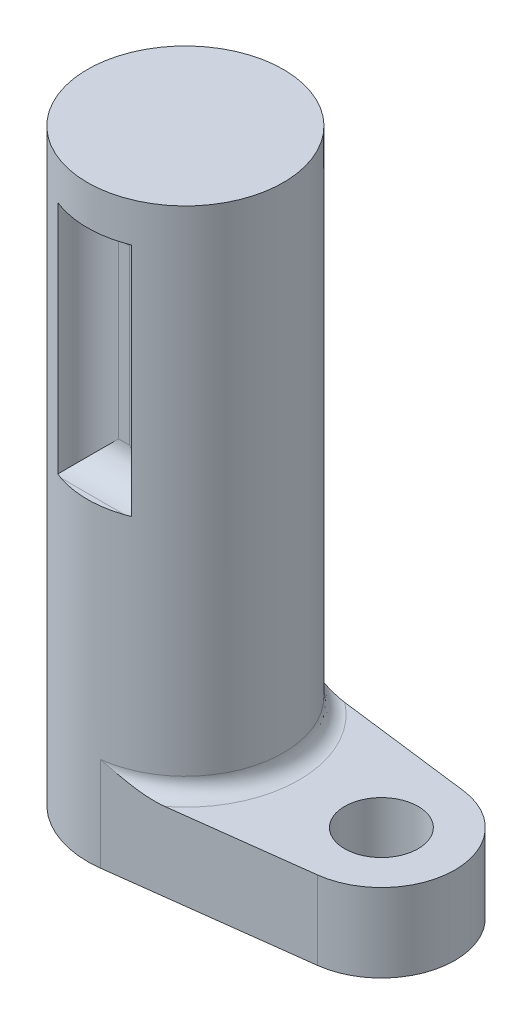
ISO-10303-21;
HEADER;
FILE_DESCRIPTION(('STEP AP214'),'2;1');
FILE_NAME('part.step','',(''),(''),'','','');
FILE_SCHEMA(('AUTOMOTIVE_DESIGN { 1 0 10303 214 1 1 1 1 }'));
ENDSEC;
DATA;
#1=APPLICATION_CONTEXT('core data for automotive mechanical design processes');
#2=APPLICATION_PROTOCOL_DEFINITION('international standard','automotive_design',2000,#1);
#3=PRODUCT_CONTEXT('',#1,'mechanical');
#4=PRODUCT('Part','Part','',(#3));
#5=PRODUCT_RELATED_PRODUCT_CATEGORY('part','',(#4));
#6=PRODUCT_DEFINITION_FORMATION('','',#4);
#7=PRODUCT_DEFINITION_CONTEXT('part definition',#1,'design');
#8=PRODUCT_DEFINITION('design','',#6,#7);
#9=PRODUCT_DEFINITION_SHAPE('','',#8);
#10=(LENGTH_UNIT() NAMED_UNIT(*) SI_UNIT(.MILLI.,.METRE.));
#11=(NAMED_UNIT(*) PLANE_ANGLE_UNIT() SI_UNIT($,.RADIAN.));
#12=(NAMED_UNIT(*) SI_UNIT($,.STERADIAN.) SOLID_ANGLE_UNIT());
#13=UNCERTAINTY_MEASURE_WITH_UNIT(LENGTH_MEASURE(1.E-05),#10,'distance_accuracy_value','');
#14=(GEOMETRIC_REPRESENTATION_CONTEXT(3) GLOBAL_UNCERTAINTY_ASSIGNED_CONTEXT((#13)) GLOBAL_UNIT_ASSIGNED_CONTEXT((#10,
#11,#12)) REPRESENTATION_CONTEXT('',''));
#15=CARTESIAN_POINT('',(0.,0.,0.));
#16=DIRECTION('',(0.,0.,1.));
#17=DIRECTION('',(1.,0.,0.));
#18=AXIS2_PLACEMENT_3D('',#15,#16,#17);
#19=CARTESIAN_POINT('',(0.,16.51,0.));
#20=DIRECTION('',(0.,-1.,0.));
#21=DIRECTION('',(0.,0.,-1.));
#22=AXIS2_PLACEMENT_3D('',#19,#20,#21);
#23=CYLINDRICAL_SURFACE('',#22,3.175);
#24=CARTESIAN_POINT('',(0.,0.508000000000002,0.));
#25=DIRECTION('',(0.,-1.,0.));
#26=DIRECTION('',(0.,0.,-1.));
#27=AXIS2_PLACEMENT_3D('',#24,#25,#26);
#28=CIRCLE('',#27,3.175);
#29=CARTESIAN_POINT('',(0.396875,0.508000000000002,3.15009765473628));
#30=VERTEX_POINT('',#29);
#31=CARTESIAN_POINT('',(0.396875,0.508000000000002,-3.15009765473628));
#32=VERTEX_POINT('',#31);
#33=EDGE_CURVE('E168',#30,#32,#28,.F.);
#34=ORIENTED_EDGE('',*,*,#33,.T.);
#35=DIRECTION('',(0.,1.,0.));
#36=VECTOR('',#35,1.);
#37=CARTESIAN_POINT('',(0.396875,-2.54,-3.15009765473628));
#38=LINE('',#37,#36);
#39=CARTESIAN_POINT('',(0.396875,-2.54,-3.15009765473628));
#40=VERTEX_POINT('',#39);
#41=EDGE_CURVE('E153',#40,#32,#38,.T.);
#42=ORIENTED_EDGE('',*,*,#41,.F.);
#43=CARTESIAN_POINT('',(0.,-2.54,0.));
#44=DIRECTION('',(0.,-1.,0.));
#45=DIRECTION('',(0.,0.,-1.));
#46=AXIS2_PLACEMENT_3D('',#43,#44,#45);
#47=CIRCLE('',#46,3.175);
#48=CARTESIAN_POINT('',(0.396875,-2.54,3.15009765473628));
#49=VERTEX_POINT('',#48);
#50=EDGE_CURVE('E141',#49,#40,#47,.T.);
#51=ORIENTED_EDGE('',*,*,#50,.F.);
#52=DIRECTION('',(0.,1.,0.));
#53=VECTOR('',#52,1.);
#54=CARTESIAN_POINT('',(0.396875,-2.54,3.15009765473628));
#55=LINE('',#54,#53);
#56=EDGE_CURVE('E163',#49,#30,#55,.T.);
#57=ORIENTED_EDGE('',*,*,#56,.T.);
#58=EDGE_LOOP('',(#34,#42,#51,#57));
#59=FACE_BOUND('',#58,.T.);
#60=CARTESIAN_POINT('',(0.,16.51,0.));
#61=DIRECTION('',(0.,1.,0.));
#62=DIRECTION('',(0.,0.,1.));
#63=AXIS2_PLACEMENT_3D('',#60,#61,#62);
#64=CIRCLE('',#63,3.175);
#65=CARTESIAN_POINT('',(0.,16.51,3.175));
#66=VERTEX_POINT('',#65);
#67=EDGE_CURVE('E131',#66,#66,#64,.T.);
#68=ORIENTED_EDGE('',*,*,#67,.F.);
#69=EDGE_LOOP('',(#68));
#70=FACE_BOUND('',#69,.T.);
#71=CARTESIAN_POINT('',(0.,15.24,0.));
#72=DIRECTION('',(0.,-1.,0.));
#73=DIRECTION('',(0.,0.,-1.));
#74=AXIS2_PLACEMENT_3D('',#71,#72,#73);
#75=CIRCLE('',#74,3.175);
#76=CARTESIAN_POINT('',(1.03292778140585,15.24,3.00228));
#77=VERTEX_POINT('',#76);
#78=CARTESIAN_POINT('',(-1.03292778140585,15.24,3.00228));
#79=VERTEX_POINT('',#78);
#80=EDGE_CURVE('E250',#77,#79,#75,.T.);
#81=ORIENTED_EDGE('',*,*,#80,.F.);
#82=CARTESIAN_POINT('',(1.03292778140585,15.24,3.00228));
#83=CARTESIAN_POINT('',(1.05947422604966,15.2400200288164,2.99314652903374));
#84=CARTESIAN_POINT('',(1.08588888328537,15.2398872803439,2.98366510808526));
#85=CARTESIAN_POINT('',(1.1384546228155,15.2393162288226,2.96400636627064));
#86=CARTESIAN_POINT('',(1.16460570511117,15.2388779257752,2.95382904540782));
#87=CARTESIAN_POINT('',(1.190625,15.2382868454405,2.94330377456609));
#88=B_SPLINE_CURVE_WITH_KNOTS('',3,(#82,#83,#84,#85,#86,#87),.UNSPECIFIED.,.F.,.F.,(4,2,4),(0.,
0.0841952596062047,0.168390518811633),.UNSPECIFIED.);
#89=CARTESIAN_POINT('',(1.190625,15.2382868454405,2.94330377456609));
#90=VERTEX_POINT('',#89);
#91=EDGE_CURVE('E11',#77,#90,#88,.T.);
#92=ORIENTED_EDGE('',*,*,#91,.T.);
#93=DIRECTION('',(0.,-1.,0.));
#94=VECTOR('',#93,1.);
#95=CARTESIAN_POINT('',(1.190625,16.51,2.94330377456609));
#96=LINE('',#95,#94);
#97=CARTESIAN_POINT('',(1.190625,7.62171315455953,2.94330377456609));
#98=VERTEX_POINT('',#97);
#99=EDGE_CURVE('E249',#98,#90,#96,.F.);
#100=ORIENTED_EDGE('',*,*,#99,.F.);
#101=CARTESIAN_POINT('',(1.190625,7.62171315455953,2.94330377456609));
#102=CARTESIAN_POINT('',(1.16460570511117,7.62112207422477,2.95382904540782));
#103=CARTESIAN_POINT('',(1.1384546228155,7.62068377117741,2.96400636627064));
#104=CARTESIAN_POINT('',(1.08588888328537,7.62011271965611,2.98366510808526));
#105=CARTESIAN_POINT('',(1.05947422604966,7.61997997118363,2.99314652903374));
#106=CARTESIAN_POINT('',(1.03292778140585,7.62,3.00228));
#107=B_SPLINE_CURVE_WITH_KNOTS('',3,(#101,#102,#103,#104,#105,#106),.UNSPECIFIED.,.F.,.F.,(4,2,
4),(0.,0.0841952592054279,0.168390518811633),.UNSPECIFIED.);
#108=CARTESIAN_POINT('',(1.03292778140585,7.62,3.00228));
#109=VERTEX_POINT('',#108);
#110=EDGE_CURVE('E218',#98,#109,#107,.T.);
#111=ORIENTED_EDGE('',*,*,#110,.T.);
#112=CARTESIAN_POINT('',(0.,7.62,0.));
#113=DIRECTION('',(0.,-1.,0.));
#114=DIRECTION('',(0.,0.,-1.));
#115=AXIS2_PLACEMENT_3D('',#112,#113,#114);
#116=CIRCLE('',#115,3.175);
#117=CARTESIAN_POINT('',(-1.03292778140585,7.62,3.00228));
#118=VERTEX_POINT('',#117);
#119=EDGE_CURVE('E255',#109,#118,#116,.T.);
#120=ORIENTED_EDGE('',*,*,#119,.T.);
#121=CARTESIAN_POINT('',(-1.03292778140585,7.62,3.00228));
#122=CARTESIAN_POINT('',(-1.05947422604966,7.61997997118363,2.99314652903374));
#123=CARTESIAN_POINT('',(-1.08588888328537,7.62011271965611,2.98366510808526));
#124=CARTESIAN_POINT('',(-1.1384546228155,7.62068377117741,2.96400636627064));
#125=CARTESIAN_POINT('',(-1.16460570511117,7.62112207422477,2.95382904540782));
#126=CARTESIAN_POINT('',(-1.190625,7.62171315455953,2.94330377456609));
#127=B_SPLINE_CURVE_WITH_KNOTS('',3,(#121,#122,#123,#124,#125,#126),.UNSPECIFIED.,.F.,.F.,(4,2,
4),(0.,0.0841952596062047,0.168390518811633),.UNSPECIFIED.);
#128=CARTESIAN_POINT('',(-1.190625,7.62171315455953,2.94330377456609));
#129=VERTEX_POINT('',#128);
#130=EDGE_CURVE('E212',#118,#129,#127,.T.);
#131=ORIENTED_EDGE('',*,*,#130,.T.);
#132=DIRECTION('',(0.,-1.,0.));
#133=VECTOR('',#132,1.);
#134=CARTESIAN_POINT('',(-1.190625,16.51,2.94330377456609));
#135=LINE('',#134,#133);
#136=CARTESIAN_POINT('',(-1.190625,15.2382868454405,2.94330377456609));
#137=VERTEX_POINT('',#136);
#138=EDGE_CURVE('E251',#137,#129,#135,.T.);
#139=ORIENTED_EDGE('',*,*,#138,.F.);
#140=CARTESIAN_POINT('',(-1.190625,15.2382868454405,2.94330377456609));
#141=CARTESIAN_POINT('',(-1.16460570511117,15.2388779257752,2.95382904540782));
#142=CARTESIAN_POINT('',(-1.1384546228155,15.2393162288226,2.96400636627064));
#143=CARTESIAN_POINT('',(-1.08588888328537,15.2398872803439,2.98366510808526));
#144=CARTESIAN_POINT('',(-1.05947422604966,15.2400200288164,2.99314652903374));
#145=CARTESIAN_POINT('',(-1.03292778140585,15.24,3.00228));
#146=B_SPLINE_CURVE_WITH_KNOTS('',3,(#140,#141,#142,#143,#144,#145),.UNSPECIFIED.,.F.,.F.,(4,2,
4),(0.,0.0841952592054285,0.168390518811633),.UNSPECIFIED.);
#147=EDGE_CURVE('E46',#137,#79,#146,.T.);
#148=ORIENTED_EDGE('',*,*,#147,.T.);
#149=EDGE_LOOP('',(#81,#92,#100,#111,#120,#131,#139,#148));
#150=FACE_BOUND('',#149,.T.);
#151=ADVANCED_FACE('F37',(#59,#70,#150),#23,.T.);
#152=CARTESIAN_POINT('',(0.,16.51,0.));
#153=DIRECTION('',(0.,1.,0.));
#154=DIRECTION('',(0.,0.,1.));
#155=AXIS2_PLACEMENT_3D('',#152,#153,#154);
#156=PLANE('',#155);
#157=ORIENTED_EDGE('',*,*,#67,.T.);
#158=EDGE_LOOP('',(#157));
#159=FACE_BOUND('',#158,.T.);
#160=ADVANCED_FACE('F285',(#159),#156,.T.);
#161=CARTESIAN_POINT('',(0.396875,-2.54,-3.15009765473628));
#162=DIRECTION('',(0.125,0.,-0.992156741649221));
#163=DIRECTION('',(-0.992156741649222,0.,-0.125));
#164=AXIS2_PLACEMENT_3D('',#161,#162,#163);
#165=PLANE('',#164);
#166=DIRECTION('',(-0.992156741649222,0.,-0.125));
#167=VECTOR('',#166,1.);
#168=CARTESIAN_POINT('',(0.396875,0.,-3.15009765473628));
#169=LINE('',#168,#167);
#170=CARTESIAN_POINT('',(6.64765625,0.,-2.36257324105221));
#171=VERTEX_POINT('',#170);
#172=CARTESIAN_POINT('',(2.24874665457004,0.,-2.91678375673618));
#173=VERTEX_POINT('',#172);
#174=EDGE_CURVE('E126',#171,#173,#169,.T.);
#175=ORIENTED_EDGE('',*,*,#174,.F.);
#176=DIRECTION('',(0.,1.,0.));
#177=VECTOR('',#176,1.);
#178=CARTESIAN_POINT('',(6.64765625,-2.54,-2.36257324105221));
#179=LINE('',#178,#177);
#180=CARTESIAN_POINT('',(6.64765625,-2.54,-2.36257324105221));
#181=VERTEX_POINT('',#180);
#182=EDGE_CURVE('E121',#181,#171,#179,.T.);
#183=ORIENTED_EDGE('',*,*,#182,.F.);
#184=DIRECTION('',(-0.992156741649222,0.,-0.125));
#185=VECTOR('',#184,1.);
#186=CARTESIAN_POINT('',(0.396875,-2.54,-3.15009765473628));
#187=LINE('',#186,#185);
#188=EDGE_CURVE('E124',#181,#40,#187,.T.);
#189=ORIENTED_EDGE('',*,*,#188,.T.);
#190=ORIENTED_EDGE('',*,*,#41,.T.);
#191=CARTESIAN_POINT('',(2.24874665457004,0.,-2.91678375673618));
#192=CARTESIAN_POINT('',(2.21231549692085,5.71728721592752E-06,-2.92137365117018));
#193=CARTESIAN_POINT('',(2.1758992098971,0.00102172884681024,-2.92596167208147));
#194=CARTESIAN_POINT('',(2.1031796100752,0.00485117368516612,-2.93512348048952));
#195=CARTESIAN_POINT('',(2.0668762431913,0.00766354336836887,-2.93969727480043));
#196=CARTESIAN_POINT('',(1.95839957562028,0.0184425634130274,-2.95336405029785));
#197=CARTESIAN_POINT('',(1.88645399557375,0.0287536847308181,-2.9624283413804));
#198=CARTESIAN_POINT('',(1.74411958427555,0.0541431163065831,-2.98036079163286));
#199=CARTESIAN_POINT('',(1.67372251439236,0.0691765666242501,-2.9892299887728));
#200=CARTESIAN_POINT('',(1.53378182393322,0.103023101549795,-3.00686085854677));
#201=CARTESIAN_POINT('',(1.46423892542614,0.121839177901396,-3.01562244020869));
#202=CARTESIAN_POINT('',(1.22704733837716,0.191369163494823,-3.04550577127576));
#203=CARTESIAN_POINT('',(1.06148442447234,0.249183267367272,-3.06636473777706));
#204=CARTESIAN_POINT('',(0.73302229538363,0.372566088486213,-3.10774707628523));
#205=CARTESIAN_POINT('',(0.570129927965523,0.438151996715627,-3.12826958555471));
#206=CARTESIAN_POINT('',(0.403795894832264,0.505209760541777,-3.14922570394694));
#207=CARTESIAN_POINT('',(0.400335450392073,0.506604880917865,-3.14966167896667));
#208=CARTESIAN_POINT('',(0.396875,0.508000000000002,-3.15009765473628));
#209=B_SPLINE_CURVE_WITH_KNOTS('',3,(#191,#192,#193,#194,#195,#196,#197,#198,#199,#200,#201,
#202,#203,#204,#205,#206,#207,#208),.UNSPECIFIED.,.F.,.F.,(4,2,2,2,2,2,2,2,4),(0.,
0.110120572144947,0.22017600398342,0.439667149666635,0.657133261980571,0.874772053488899,
1.40399836213705,1.93441795718018,1.94568738488306),.UNSPECIFIED.);
#210=EDGE_CURVE('E173',#32,#173,#209,.F.);
#211=ORIENTED_EDGE('',*,*,#210,.T.);
#212=EDGE_LOOP('',(#175,#183,#189,#190,#211));
#213=FACE_BOUND('',#212,.T.);
#214=ADVANCED_FACE('F123',(#213),#165,.T.);
#215=CARTESIAN_POINT('',(6.35,-2.54,0.));
#216=DIRECTION('',(0.,1.,0.));
#217=DIRECTION('',(0.,0.,1.));
#218=AXIS2_PLACEMENT_3D('',#215,#216,#217);
#219=CYLINDRICAL_SURFACE('',#218,2.38125);
#220=CARTESIAN_POINT('',(6.35,0.,0.));
#221=DIRECTION('',(0.,-1.,0.));
#222=DIRECTION('',(0.,0.,-1.));
#223=AXIS2_PLACEMENT_3D('',#220,#221,#222);
#224=CIRCLE('',#223,2.38125);
#225=CARTESIAN_POINT('',(6.64765625,0.,2.36257324105221));
#226=VERTEX_POINT('',#225);
#227=EDGE_CURVE('E158',#226,#171,#224,.F.);
#228=ORIENTED_EDGE('',*,*,#227,.F.);
#229=DIRECTION('',(0.,1.,0.));
#230=VECTOR('',#229,1.);
#231=CARTESIAN_POINT('',(6.64765625,-2.54,2.36257324105221));
#232=LINE('',#231,#230);
#233=CARTESIAN_POINT('',(6.64765625,-2.54,2.36257324105221));
#234=VERTEX_POINT('',#233);
#235=EDGE_CURVE('E132',#234,#226,#232,.T.);
#236=ORIENTED_EDGE('',*,*,#235,.F.);
#237=CARTESIAN_POINT('',(6.35,-2.54,0.));
#238=DIRECTION('',(0.,-1.,0.));
#239=DIRECTION('',(0.,0.,-1.));
#240=AXIS2_PLACEMENT_3D('',#237,#238,#239);
#241=CIRCLE('',#240,2.38125);
#242=EDGE_CURVE('E138',#234,#181,#241,.F.);
#243=ORIENTED_EDGE('',*,*,#242,.T.);
#244=ORIENTED_EDGE('',*,*,#182,.T.);
#245=EDGE_LOOP('',(#228,#236,#243,#244));
#246=FACE_BOUND('',#245,.T.);
#247=ADVANCED_FACE('F145',(#246),#219,.T.);
#248=CARTESIAN_POINT('',(0.396875,-2.54,3.15009765473628));
#249=DIRECTION('',(0.125,0.,0.992156741649221));
#250=DIRECTION('',(0.992156741649222,0.,-0.125));
#251=AXIS2_PLACEMENT_3D('',#248,#249,#250);
#252=PLANE('',#251);
#253=DIRECTION('',(0.992156741649222,0.,-0.125));
#254=VECTOR('',#253,1.);
#255=CARTESIAN_POINT('',(0.396875,0.,3.15009765473628));
#256=LINE('',#255,#254);
#257=CARTESIAN_POINT('',(2.24874665457004,0.,2.91678375673618));
#258=VERTEX_POINT('',#257);
#259=EDGE_CURVE('E160',#258,#226,#256,.T.);
#260=ORIENTED_EDGE('',*,*,#259,.F.);
#261=CARTESIAN_POINT('',(2.24874665457004,0.,2.91678375673618));
#262=CARTESIAN_POINT('',(2.21231549692086,5.71728721580148E-06,2.92137365117018));
#263=CARTESIAN_POINT('',(2.17589920989712,0.00102172884680957,2.92596167208147));
#264=CARTESIAN_POINT('',(2.10317961007524,0.00485117368516336,2.93512348048951));
#265=CARTESIAN_POINT('',(2.06687624319136,0.00766354336836454,2.93969727480042));
#266=CARTESIAN_POINT('',(1.95839957562036,0.0184425634130171,2.95336405029784));
#267=CARTESIAN_POINT('',(1.88645399557386,0.028753684730802,2.96242834138038));
#268=CARTESIAN_POINT('',(1.74411958427564,0.0541431163065639,2.98036079163285));
#269=CARTESIAN_POINT('',(1.67372251439244,0.0691765666242362,2.98922998877279));
#270=CARTESIAN_POINT('',(1.53378182393325,0.103023101549782,3.00686085854677));
#271=CARTESIAN_POINT('',(1.46423892542615,0.121839177901378,3.01562244020869));
#272=CARTESIAN_POINT('',(1.22704733837717,0.191369163494857,3.04550577127576));
#273=CARTESIAN_POINT('',(1.0614844244724,0.249183267367469,3.06636473777705));
#274=CARTESIAN_POINT('',(0.733022295383541,0.372566088486026,3.10774707628524));
#275=CARTESIAN_POINT('',(0.570129927965227,0.438151996714891,3.12826958555474));
#276=CARTESIAN_POINT('',(0.403795894832254,0.505209760541744,3.14922570394694));
#277=CARTESIAN_POINT('',(0.400335450392068,0.506604880917849,3.14966167896667));
#278=CARTESIAN_POINT('',(0.396875,0.508000000000002,3.15009765473628));
#279=B_SPLINE_CURVE_WITH_KNOTS('',3,(#261,#262,#263,#264,#265,#266,#267,#268,#269,#270,#271,
#272,#273,#274,#275,#276,#277,#278),.UNSPECIFIED.,.F.,.F.,(4,2,2,2,2,2,2,2,4),(0.,
0.110120572144913,0.220176003983352,0.439667149666513,0.657133261980515,0.874772053488902,
1.40399836213707,1.93441795718017,1.94568738488306),.UNSPECIFIED.);
#280=EDGE_CURVE('E180',#258,#30,#279,.T.);
#281=ORIENTED_EDGE('',*,*,#280,.T.);
#282=ORIENTED_EDGE('',*,*,#56,.F.);
#283=DIRECTION('',(0.992156741649222,0.,-0.125));
#284=VECTOR('',#283,1.);
#285=CARTESIAN_POINT('',(0.396875,-2.54,3.15009765473628));
#286=LINE('',#285,#284);
#287=EDGE_CURVE('E147',#49,#234,#286,.T.);
#288=ORIENTED_EDGE('',*,*,#287,.T.);
#289=ORIENTED_EDGE('',*,*,#235,.T.);
#290=EDGE_LOOP('',(#260,#281,#282,#288,#289));
#291=FACE_BOUND('',#290,.T.);
#292=ADVANCED_FACE('F302',(#291),#252,.T.);
#293=CARTESIAN_POINT('',(6.35,-2.54,0.));
#294=DIRECTION('',(0.,1.,0.));
#295=DIRECTION('',(0.,0.,1.));
#296=AXIS2_PLACEMENT_3D('',#293,#294,#295);
#297=CYLINDRICAL_SURFACE('',#296,1.190625);
#298=CARTESIAN_POINT('',(6.35,-2.54,0.));
#299=DIRECTION('',(0.,-1.,0.));
#300=DIRECTION('',(0.,0.,-1.));
#301=AXIS2_PLACEMENT_3D('',#298,#299,#300);
#302=CIRCLE('',#301,1.190625);
#303=CARTESIAN_POINT('',(6.35,-2.54,-1.190625));
#304=VERTEX_POINT('',#303);
#305=EDGE_CURVE('E143',#304,#304,#302,.T.);
#306=ORIENTED_EDGE('',*,*,#305,.T.);
#307=EDGE_LOOP('',(#306));
#308=FACE_BOUND('',#307,.T.);
#309=CARTESIAN_POINT('',(6.35,0.,0.));
#310=DIRECTION('',(0.,-1.,0.));
#311=DIRECTION('',(0.,0.,-1.));
#312=AXIS2_PLACEMENT_3D('',#309,#310,#311);
#313=CIRCLE('',#312,1.190625);
#314=CARTESIAN_POINT('',(6.35,0.,-1.190625));
#315=VERTEX_POINT('',#314);
#316=EDGE_CURVE('E154',#315,#315,#313,.T.);
#317=ORIENTED_EDGE('',*,*,#316,.F.);
#318=EDGE_LOOP('',(#317));
#319=FACE_BOUND('',#318,.T.);
#320=ADVANCED_FACE('F304',(#308,#319),#297,.F.);
#321=CARTESIAN_POINT('',(0.,-2.54,0.));
#322=DIRECTION('',(0.,-1.,0.));
#323=DIRECTION('',(0.,0.,-1.));
#324=AXIS2_PLACEMENT_3D('',#321,#322,#323);
#325=PLANE('',#324);
#326=ORIENTED_EDGE('',*,*,#305,.F.);
#327=EDGE_LOOP('',(#326));
#328=FACE_BOUND('',#327,.T.);
#329=ORIENTED_EDGE('',*,*,#188,.F.);
#330=ORIENTED_EDGE('',*,*,#242,.F.);
#331=ORIENTED_EDGE('',*,*,#287,.F.);
#332=ORIENTED_EDGE('',*,*,#50,.T.);
#333=EDGE_LOOP('',(#329,#330,#331,#332));
#334=FACE_BOUND('',#333,.T.);
#335=ADVANCED_FACE('F136',(#328,#334),#325,.T.);
#336=CARTESIAN_POINT('',(0.,0.,0.));
#337=DIRECTION('',(0.,-1.,0.));
#338=DIRECTION('',(0.,0.,-1.));
#339=AXIS2_PLACEMENT_3D('',#336,#337,#338);
#340=PLANE('',#339);
#341=ORIENTED_EDGE('',*,*,#174,.T.);
#342=CARTESIAN_POINT('',(0.,0.,0.));
#343=DIRECTION('',(0.,-1.,0.));
#344=DIRECTION('',(0.,0.,-1.));
#345=AXIS2_PLACEMENT_3D('',#342,#343,#344);
#346=CIRCLE('',#345,3.683);
#347=EDGE_CURVE('E171',#173,#258,#346,.T.);
#348=ORIENTED_EDGE('',*,*,#347,.T.);
#349=ORIENTED_EDGE('',*,*,#259,.T.);
#350=ORIENTED_EDGE('',*,*,#227,.T.);
#351=EDGE_LOOP('',(#341,#348,#349,#350));
#352=FACE_BOUND('',#351,.T.);
#353=ORIENTED_EDGE('',*,*,#316,.T.);
#354=EDGE_LOOP('',(#353));
#355=FACE_BOUND('',#354,.T.);
#356=ADVANCED_FACE('F195',(#352,#355),#340,.F.);
#357=CARTESIAN_POINT('',(0.,0.508000000000002,0.));
#358=DIRECTION('',(0.,-1.,0.));
#359=DIRECTION('',(0.,0.,-1.));
#360=AXIS2_PLACEMENT_3D('',#357,#358,#359);
#361=TOROIDAL_SURFACE('',#360,3.683,0.508);
#362=ORIENTED_EDGE('',*,*,#280,.F.);
#363=ORIENTED_EDGE('',*,*,#347,.F.);
#364=ORIENTED_EDGE('',*,*,#210,.F.);
#365=ORIENTED_EDGE('',*,*,#33,.F.);
#366=EDGE_LOOP('',(#362,#363,#364,#365));
#367=FACE_BOUND('',#366,.T.);
#368=ADVANCED_FACE('F189',(#367),#361,.F.);
#369=CARTESIAN_POINT('',(0.,15.24,0.));
#370=DIRECTION('',(0.,-1.,0.));
#371=DIRECTION('',(0.,0.,-1.));
#372=AXIS2_PLACEMENT_3D('',#369,#370,#371);
#373=PLANE('',#372);
#374=ORIENTED_EDGE('',*,*,#80,.T.);
#375=DIRECTION('',(-1.,0.,0.));
#376=VECTOR('',#375,1.);
#377=CARTESIAN_POINT('',(1.190625,15.24,3.00228));
#378=LINE('',#377,#376);
#379=EDGE_CURVE('E59',#79,#77,#378,.F.);
#380=ORIENTED_EDGE('',*,*,#379,.T.);
#381=EDGE_LOOP('',(#374,#380));
#382=FACE_BOUND('',#381,.T.);
#383=ADVANCED_FACE('F194',(#382),#373,.T.);
#384=CARTESIAN_POINT('',(0.,7.62,0.));
#385=DIRECTION('',(0.,-1.,0.));
#386=DIRECTION('',(0.,0.,-1.));
#387=AXIS2_PLACEMENT_3D('',#384,#385,#386);
#388=PLANE('',#387);
#389=ORIENTED_EDGE('',*,*,#119,.F.);
#390=DIRECTION('',(-1.,0.,0.));
#391=VECTOR('',#390,1.);
#392=CARTESIAN_POINT('',(0.,7.62,3.00228));
#393=LINE('',#392,#391);
#394=EDGE_CURVE('E265',#109,#118,#393,.T.);
#395=ORIENTED_EDGE('',*,*,#394,.T.);
#396=EDGE_LOOP('',(#389,#395));
#397=FACE_BOUND('',#396,.T.);
#398=ADVANCED_FACE('F275',(#397),#388,.F.);
#399=CARTESIAN_POINT('',(-1.190625,15.24,1.98628));
#400=DIRECTION('',(0.,0.,1.));
#401=DIRECTION('',(1.,0.,0.));
#402=AXIS2_PLACEMENT_3D('',#399,#400,#401);
#403=PLANE('',#402);
#404=DIRECTION('',(0.,1.,0.));
#405=VECTOR('',#404,1.);
#406=CARTESIAN_POINT('',(-0.176338154559536,7.62,1.98628));
#407=LINE('',#406,#405);
#408=CARTESIAN_POINT('',(-0.176338154559536,14.224,1.98628));
#409=VERTEX_POINT('',#408);
#410=CARTESIAN_POINT('',(-0.176338154559536,8.636,1.98628));
#411=VERTEX_POINT('',#410);
#412=EDGE_CURVE('E260',#409,#411,#407,.F.);
#413=ORIENTED_EDGE('',*,*,#412,.T.);
#414=DIRECTION('',(-1.,0.,0.));
#415=VECTOR('',#414,1.);
#416=CARTESIAN_POINT('',(-1.190625,8.636,1.98628));
#417=LINE('',#416,#415);
#418=CARTESIAN_POINT('',(0.176338154559535,8.636,1.98628));
#419=VERTEX_POINT('',#418);
#420=EDGE_CURVE('E263',#411,#419,#417,.F.);
#421=ORIENTED_EDGE('',*,*,#420,.T.);
#422=DIRECTION('',(0.,1.,0.));
#423=VECTOR('',#422,1.);
#424=CARTESIAN_POINT('',(0.176338154559535,15.24,1.98628));
#425=LINE('',#424,#423);
#426=CARTESIAN_POINT('',(0.176338154559535,14.224,1.98628));
#427=VERTEX_POINT('',#426);
#428=EDGE_CURVE('E248',#419,#427,#425,.T.);
#429=ORIENTED_EDGE('',*,*,#428,.T.);
#430=DIRECTION('',(-1.,0.,0.));
#431=VECTOR('',#430,1.);
#432=CARTESIAN_POINT('',(-1.190625,14.224,1.98628));
#433=LINE('',#432,#431);
#434=EDGE_CURVE('E244',#427,#409,#433,.T.);
#435=ORIENTED_EDGE('',*,*,#434,.T.);
#436=EDGE_LOOP('',(#413,#421,#429,#435));
#437=FACE_BOUND('',#436,.T.);
#438=ADVANCED_FACE('F273',(#437),#403,.T.);
#439=CARTESIAN_POINT('',(0.176338154559535,16.51,3.00228));
#440=DIRECTION('',(0.,-1.,0.));
#441=DIRECTION('',(0.,0.,-1.));
#442=AXIS2_PLACEMENT_3D('',#439,#440,#441);
#443=CYLINDRICAL_SURFACE('',#442,1.016);
#444=CARTESIAN_POINT('',(0.176338154559535,8.636,3.00228));
#445=DIRECTION('',(-0.707106781186547,-0.707106781186547,0.));
#446=DIRECTION('',(0.707106781186547,-0.707106781186547,0.));
#447=AXIS2_PLACEMENT_3D('',#444,#445,#446);
#448=ELLIPSE('',#447,1.43684097937106,1.016);
#449=EDGE_CURVE('E233',#98,#419,#448,.F.);
#450=ORIENTED_EDGE('',*,*,#449,.F.);
#451=ORIENTED_EDGE('',*,*,#99,.T.);
#452=CARTESIAN_POINT('',(0.176338154559535,14.224,3.00228));
#453=DIRECTION('',(0.707106781186547,-0.707106781186547,0.));
#454=DIRECTION('',(-0.707106781186547,-0.707106781186547,0.));
#455=AXIS2_PLACEMENT_3D('',#452,#453,#454);
#456=ELLIPSE('',#455,1.43684097937106,1.016);
#457=EDGE_CURVE('E41',#427,#90,#456,.T.);
#458=ORIENTED_EDGE('',*,*,#457,.F.);
#459=ORIENTED_EDGE('',*,*,#428,.F.);
#460=EDGE_LOOP('',(#450,#451,#458,#459));
#461=FACE_BOUND('',#460,.T.);
#462=ADVANCED_FACE('F39',(#461),#443,.F.);
#463=CARTESIAN_POINT('',(-1.190625,14.224,3.00228));
#464=DIRECTION('',(1.,0.,0.));
#465=DIRECTION('',(0.,0.,-1.));
#466=AXIS2_PLACEMENT_3D('',#463,#464,#465);
#467=CYLINDRICAL_SURFACE('',#466,1.016);
#468=ORIENTED_EDGE('',*,*,#379,.F.);
#469=ORIENTED_EDGE('',*,*,#147,.F.);
#470=CARTESIAN_POINT('',(-0.176338154559536,14.224,3.00228));
#471=DIRECTION('',(-0.707106781186547,-0.707106781186547,0.));
#472=DIRECTION('',(0.707106781186547,-0.707106781186547,0.));
#473=AXIS2_PLACEMENT_3D('',#470,#471,#472);
#474=ELLIPSE('',#473,1.43684097937106,1.016);
#475=EDGE_CURVE('E232',#409,#137,#474,.F.);
#476=ORIENTED_EDGE('',*,*,#475,.F.);
#477=ORIENTED_EDGE('',*,*,#434,.F.);
#478=ORIENTED_EDGE('',*,*,#457,.T.);
#479=ORIENTED_EDGE('',*,*,#91,.F.);
#480=EDGE_LOOP('',(#468,#469,#476,#477,#478,#479));
#481=FACE_BOUND('',#480,.T.);
#482=ADVANCED_FACE('F207',(#481),#467,.F.);
#483=CARTESIAN_POINT('',(0.,8.636,3.00228));
#484=DIRECTION('',(-1.,0.,0.));
#485=DIRECTION('',(0.,0.,1.));
#486=AXIS2_PLACEMENT_3D('',#483,#484,#485);
#487=CYLINDRICAL_SURFACE('',#486,1.016);
#488=ORIENTED_EDGE('',*,*,#449,.T.);
#489=ORIENTED_EDGE('',*,*,#420,.F.);
#490=CARTESIAN_POINT('',(-0.176338154559536,8.636,3.00228));
#491=DIRECTION('',(0.707106781186547,-0.707106781186547,0.));
#492=DIRECTION('',(-0.707106781186547,-0.707106781186547,0.));
#493=AXIS2_PLACEMENT_3D('',#490,#491,#492);
#494=ELLIPSE('',#493,1.43684097937106,1.016);
#495=EDGE_CURVE('E230',#129,#411,#494,.T.);
#496=ORIENTED_EDGE('',*,*,#495,.F.);
#497=ORIENTED_EDGE('',*,*,#130,.F.);
#498=ORIENTED_EDGE('',*,*,#394,.F.);
#499=ORIENTED_EDGE('',*,*,#110,.F.);
#500=EDGE_LOOP('',(#488,#489,#496,#497,#498,#499));
#501=FACE_BOUND('',#500,.T.);
#502=ADVANCED_FACE('F203',(#501),#487,.F.);
#503=CARTESIAN_POINT('',(-0.176338154559536,16.51,3.00228));
#504=DIRECTION('',(0.,-1.,0.));
#505=DIRECTION('',(0.,0.,-1.));
#506=AXIS2_PLACEMENT_3D('',#503,#504,#505);
#507=CYLINDRICAL_SURFACE('',#506,1.016);
#508=ORIENTED_EDGE('',*,*,#475,.T.);
#509=ORIENTED_EDGE('',*,*,#138,.T.);
#510=ORIENTED_EDGE('',*,*,#495,.T.);
#511=ORIENTED_EDGE('',*,*,#412,.F.);
#512=EDGE_LOOP('',(#508,#509,#510,#511));
#513=FACE_BOUND('',#512,.T.);
#514=ADVANCED_FACE('F199',(#513),#507,.F.);
#515=CLOSED_SHELL('',(#151,#160,#214,#247,#292,#320,#335,#356,#368,#383,#398,#438,#462,#482,
#502,#514));
#516=MANIFOLD_SOLID_BREP('B2',#515);
#517=ADVANCED_BREP_SHAPE_REPRESENTATION('',(#18,#516),#14);
#518=SHAPE_DEFINITION_REPRESENTATION(#9,#517);
ENDSEC;
END-ISO-10303-21;
